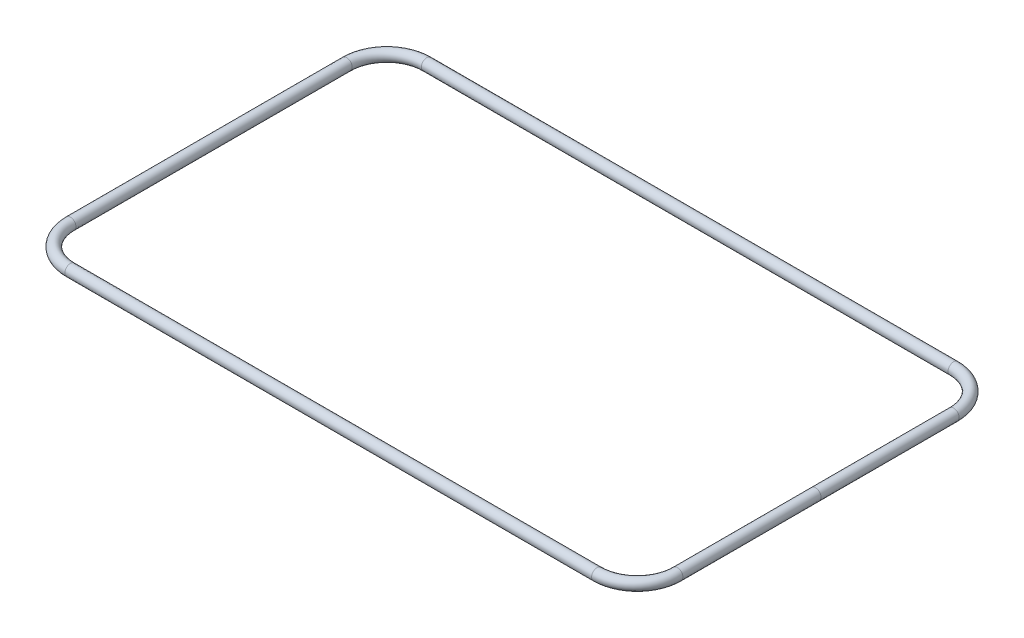
ISO-10303-21;
HEADER;
FILE_DESCRIPTION(('STEP AP214'),'2;1');
FILE_NAME('part.step','',(''),(''),'','','');
FILE_SCHEMA(('AUTOMOTIVE_DESIGN { 1 0 10303 214 1 1 1 1 }'));
ENDSEC;
DATA;
#1=APPLICATION_CONTEXT('core data for automotive mechanical design processes');
#2=APPLICATION_PROTOCOL_DEFINITION('international standard','automotive_design',2000,#1);
#3=PRODUCT_CONTEXT('',#1,'mechanical');
#4=PRODUCT('Part','Part','',(#3));
#5=PRODUCT_RELATED_PRODUCT_CATEGORY('part','',(#4));
#6=PRODUCT_DEFINITION_FORMATION('','',#4);
#7=PRODUCT_DEFINITION_CONTEXT('part definition',#1,'design');
#8=PRODUCT_DEFINITION('design','',#6,#7);
#9=PRODUCT_DEFINITION_SHAPE('','',#8);
#10=(LENGTH_UNIT() NAMED_UNIT(*) SI_UNIT(.MILLI.,.METRE.));
#11=(NAMED_UNIT(*) PLANE_ANGLE_UNIT() SI_UNIT($,.RADIAN.));
#12=(NAMED_UNIT(*) SI_UNIT($,.STERADIAN.) SOLID_ANGLE_UNIT());
#13=UNCERTAINTY_MEASURE_WITH_UNIT(LENGTH_MEASURE(1.E-05),#10,'distance_accuracy_value','');
#14=(GEOMETRIC_REPRESENTATION_CONTEXT(3) GLOBAL_UNCERTAINTY_ASSIGNED_CONTEXT((#13)) GLOBAL_UNIT_ASSIGNED_CONTEXT((#10,
#11,#12)) REPRESENTATION_CONTEXT('',''));
#15=CARTESIAN_POINT('',(0.,0.,0.));
#16=DIRECTION('',(0.,0.,1.));
#17=DIRECTION('',(1.,0.,0.));
#18=AXIS2_PLACEMENT_3D('',#15,#16,#17);
#19=CARTESIAN_POINT('',(96.0967751442048,0.,-43.7388));
#20=DIRECTION('',(0.,0.,1.));
#21=DIRECTION('',(1.,0.,0.));
#22=AXIS2_PLACEMENT_3D('',#19,#20,#21);
#23=CYLINDRICAL_SURFACE('',#22,1.76529999999999);
#24=CARTESIAN_POINT('',(96.0967751442048,0.,0.));
#25=DIRECTION('',(0.,0.,1.));
#26=DIRECTION('',(1.,0.,0.));
#27=AXIS2_PLACEMENT_3D('',#24,#25,#26);
#28=CIRCLE('',#27,1.76529999999999);
#29=CARTESIAN_POINT('',(97.8620751442048,0.,0.));
#30=VERTEX_POINT('',#29);
#31=EDGE_CURVE('E63',#30,#30,#28,.T.);
#32=ORIENTED_EDGE('',*,*,#31,.F.);
#33=EDGE_LOOP('',(#32));
#34=FACE_BOUND('',#33,.T.);
#35=CARTESIAN_POINT('',(96.0967751442048,0.,-43.7388));
#36=DIRECTION('',(0.,0.,1.));
#37=DIRECTION('',(1.,0.,0.));
#38=AXIS2_PLACEMENT_3D('',#35,#36,#37);
#39=CIRCLE('',#38,1.76529999999999);
#40=CARTESIAN_POINT('',(97.8620751442048,0.,-43.7388));
#41=VERTEX_POINT('',#40);
#42=EDGE_CURVE('E10',#41,#41,#39,.T.);
#43=ORIENTED_EDGE('',*,*,#42,.T.);
#44=EDGE_LOOP('',(#43));
#45=FACE_BOUND('',#44,.T.);
#46=ADVANCED_FACE('F32',(#34,#45),#23,.T.);
#47=CARTESIAN_POINT('',(83.3967751442048,0.,-43.7388));
#48=DIRECTION('',(0.,-1.,0.));
#49=DIRECTION('',(0.,0.,-1.));
#50=AXIS2_PLACEMENT_3D('',#47,#48,#49);
#51=TOROIDAL_SURFACE('',#50,12.7,1.76529999999999);
#52=CARTESIAN_POINT('',(83.3967751442048,0.,-56.4388));
#53=DIRECTION('',(1.,0.,0.));
#54=DIRECTION('',(0.,0.,-1.));
#55=AXIS2_PLACEMENT_3D('',#52,#53,#54);
#56=CIRCLE('',#55,1.76529999999999);
#57=CARTESIAN_POINT('',(83.3967751442048,0.,-58.2041));
#58=VERTEX_POINT('',#57);
#59=EDGE_CURVE('E38',#58,#58,#56,.T.);
#60=CARTESIAN_POINT('',(83.3967751442048,0.,-43.7388));
#61=DIRECTION('',(0.,-1.,0.));
#62=DIRECTION('',(0.,0.,-1.));
#63=AXIS2_PLACEMENT_3D('',#60,#61,#62);
#64=CIRCLE('',#63,14.4653);
#65=EDGE_CURVE('',#58,#41,#64,.T.);
#66=ORIENTED_EDGE('',*,*,#59,.T.);
#67=ORIENTED_EDGE('',*,*,#42,.F.);
#68=ORIENTED_EDGE('',*,*,#65,.T.);
#69=ORIENTED_EDGE('',*,*,#65,.F.);
#70=EDGE_LOOP('',(#66,#68,#67,#69));
#71=FACE_BOUND('',#70,.T.);
#72=ADVANCED_FACE('F70',(#71),#51,.T.);
#73=CARTESIAN_POINT('',(-83.3967751442048,0.,-56.4388));
#74=DIRECTION('',(1.,0.,0.));
#75=DIRECTION('',(0.,0.,-1.));
#76=AXIS2_PLACEMENT_3D('',#73,#74,#75);
#77=CYLINDRICAL_SURFACE('',#76,1.76529999999999);
#78=ORIENTED_EDGE('',*,*,#59,.F.);
#79=EDGE_LOOP('',(#78));
#80=FACE_BOUND('',#79,.T.);
#81=CARTESIAN_POINT('',(-83.3967751442048,0.,-56.4388));
#82=DIRECTION('',(1.,0.,0.));
#83=DIRECTION('',(0.,0.,-1.));
#84=AXIS2_PLACEMENT_3D('',#81,#82,#83);
#85=CIRCLE('',#84,1.76529999999999);
#86=CARTESIAN_POINT('',(-83.3967751442048,0.,-58.2041));
#87=VERTEX_POINT('',#86);
#88=EDGE_CURVE('E42',#87,#87,#85,.T.);
#89=ORIENTED_EDGE('',*,*,#88,.T.);
#90=EDGE_LOOP('',(#89));
#91=FACE_BOUND('',#90,.T.);
#92=ADVANCED_FACE('F74',(#80,#91),#77,.T.);
#93=CARTESIAN_POINT('',(-83.3967751442048,0.,-43.7388));
#94=DIRECTION('',(0.,-1.,0.));
#95=DIRECTION('',(0.,0.,-1.));
#96=AXIS2_PLACEMENT_3D('',#93,#94,#95);
#97=TOROIDAL_SURFACE('',#96,12.7,1.76529999999999);
#98=CARTESIAN_POINT('',(-96.0967751442048,0.,-43.7388));
#99=DIRECTION('',(0.,0.,-1.));
#100=DIRECTION('',(-1.,0.,0.));
#101=AXIS2_PLACEMENT_3D('',#98,#99,#100);
#102=CIRCLE('',#101,1.76529999999999);
#103=CARTESIAN_POINT('',(-97.8620751442048,0.,-43.7388));
#104=VERTEX_POINT('',#103);
#105=EDGE_CURVE('E46',#104,#104,#102,.T.);
#106=CARTESIAN_POINT('',(-83.3967751442048,0.,-43.7388));
#107=DIRECTION('',(0.,-1.,0.));
#108=DIRECTION('',(0.,0.,-1.));
#109=AXIS2_PLACEMENT_3D('',#106,#107,#108);
#110=CIRCLE('',#109,14.4653);
#111=EDGE_CURVE('',#104,#87,#110,.T.);
#112=ORIENTED_EDGE('',*,*,#105,.T.);
#113=ORIENTED_EDGE('',*,*,#88,.F.);
#114=ORIENTED_EDGE('',*,*,#111,.T.);
#115=ORIENTED_EDGE('',*,*,#111,.F.);
#116=EDGE_LOOP('',(#112,#114,#113,#115));
#117=FACE_BOUND('',#116,.T.);
#118=ADVANCED_FACE('F79',(#117),#97,.T.);
#119=CARTESIAN_POINT('',(-96.0967751442048,0.,43.7388));
#120=DIRECTION('',(0.,0.,-1.));
#121=DIRECTION('',(-1.,0.,0.));
#122=AXIS2_PLACEMENT_3D('',#119,#120,#121);
#123=CYLINDRICAL_SURFACE('',#122,1.76529999999999);
#124=ORIENTED_EDGE('',*,*,#105,.F.);
#125=EDGE_LOOP('',(#124));
#126=FACE_BOUND('',#125,.T.);
#127=CARTESIAN_POINT('',(-96.0967751442048,0.,43.7388));
#128=DIRECTION('',(0.,0.,-1.));
#129=DIRECTION('',(-1.,0.,0.));
#130=AXIS2_PLACEMENT_3D('',#127,#128,#129);
#131=CIRCLE('',#130,1.76529999999999);
#132=CARTESIAN_POINT('',(-97.8620751442048,0.,43.7388));
#133=VERTEX_POINT('',#132);
#134=EDGE_CURVE('E51',#133,#133,#131,.T.);
#135=ORIENTED_EDGE('',*,*,#134,.T.);
#136=EDGE_LOOP('',(#135));
#137=FACE_BOUND('',#136,.T.);
#138=ADVANCED_FACE('F85',(#126,#137),#123,.T.);
#139=CARTESIAN_POINT('',(-83.3967751442048,0.,43.7388));
#140=DIRECTION('',(0.,-1.,0.));
#141=DIRECTION('',(0.,0.,-1.));
#142=AXIS2_PLACEMENT_3D('',#139,#140,#141);
#143=TOROIDAL_SURFACE('',#142,12.7,1.76529999999999);
#144=CARTESIAN_POINT('',(-83.3967751442048,0.,56.4388));
#145=DIRECTION('',(-1.,0.,0.));
#146=DIRECTION('',(0.,0.,1.));
#147=AXIS2_PLACEMENT_3D('',#144,#145,#146);
#148=CIRCLE('',#147,1.76529999999999);
#149=CARTESIAN_POINT('',(-83.3967751442048,0.,58.2041));
#150=VERTEX_POINT('',#149);
#151=EDGE_CURVE('E54',#150,#150,#148,.T.);
#152=CARTESIAN_POINT('',(-83.3967751442048,0.,43.7388));
#153=DIRECTION('',(0.,-1.,0.));
#154=DIRECTION('',(0.,0.,-1.));
#155=AXIS2_PLACEMENT_3D('',#152,#153,#154);
#156=CIRCLE('',#155,14.4653);
#157=EDGE_CURVE('',#150,#133,#156,.T.);
#158=ORIENTED_EDGE('',*,*,#151,.T.);
#159=ORIENTED_EDGE('',*,*,#134,.F.);
#160=ORIENTED_EDGE('',*,*,#157,.T.);
#161=ORIENTED_EDGE('',*,*,#157,.F.);
#162=EDGE_LOOP('',(#158,#160,#159,#161));
#163=FACE_BOUND('',#162,.T.);
#164=ADVANCED_FACE('F89',(#163),#143,.T.);
#165=CARTESIAN_POINT('',(83.3967751442048,0.,56.4388));
#166=DIRECTION('',(-1.,0.,0.));
#167=DIRECTION('',(0.,0.,1.));
#168=AXIS2_PLACEMENT_3D('',#165,#166,#167);
#169=CYLINDRICAL_SURFACE('',#168,1.76529999999999);
#170=ORIENTED_EDGE('',*,*,#151,.F.);
#171=EDGE_LOOP('',(#170));
#172=FACE_BOUND('',#171,.T.);
#173=CARTESIAN_POINT('',(83.3967751442048,0.,56.4388));
#174=DIRECTION('',(-1.,0.,0.));
#175=DIRECTION('',(0.,0.,1.));
#176=AXIS2_PLACEMENT_3D('',#173,#174,#175);
#177=CIRCLE('',#176,1.76529999999999);
#178=CARTESIAN_POINT('',(83.3967751442048,0.,58.2041));
#179=VERTEX_POINT('',#178);
#180=EDGE_CURVE('E57',#179,#179,#177,.T.);
#181=ORIENTED_EDGE('',*,*,#180,.T.);
#182=EDGE_LOOP('',(#181));
#183=FACE_BOUND('',#182,.T.);
#184=ADVANCED_FACE('F93',(#172,#183),#169,.T.);
#185=CARTESIAN_POINT('',(83.3967751442048,0.,43.7388));
#186=DIRECTION('',(0.,-1.,0.));
#187=DIRECTION('',(0.,0.,-1.));
#188=AXIS2_PLACEMENT_3D('',#185,#186,#187);
#189=TOROIDAL_SURFACE('',#188,12.7,1.76529999999999);
#190=CARTESIAN_POINT('',(96.0967751442048,0.,43.7388));
#191=DIRECTION('',(0.,0.,1.));
#192=DIRECTION('',(1.,0.,0.));
#193=AXIS2_PLACEMENT_3D('',#190,#191,#192);
#194=CIRCLE('',#193,1.76529999999999);
#195=CARTESIAN_POINT('',(97.8620751442048,0.,43.7388));
#196=VERTEX_POINT('',#195);
#197=EDGE_CURVE('E60',#196,#196,#194,.T.);
#198=CARTESIAN_POINT('',(83.3967751442048,0.,43.7388));
#199=DIRECTION('',(0.,-1.,0.));
#200=DIRECTION('',(0.,0.,-1.));
#201=AXIS2_PLACEMENT_3D('',#198,#199,#200);
#202=CIRCLE('',#201,14.4653);
#203=EDGE_CURVE('',#196,#179,#202,.T.);
#204=ORIENTED_EDGE('',*,*,#197,.T.);
#205=ORIENTED_EDGE('',*,*,#180,.F.);
#206=ORIENTED_EDGE('',*,*,#203,.T.);
#207=ORIENTED_EDGE('',*,*,#203,.F.);
#208=EDGE_LOOP('',(#204,#206,#205,#207));
#209=FACE_BOUND('',#208,.T.);
#210=ADVANCED_FACE('F97',(#209),#189,.T.);
#211=CARTESIAN_POINT('',(96.0967751442048,0.,0.));
#212=DIRECTION('',(0.,0.,1.));
#213=DIRECTION('',(1.,0.,0.));
#214=AXIS2_PLACEMENT_3D('',#211,#212,#213);
#215=CYLINDRICAL_SURFACE('',#214,1.76529999999999);
#216=ORIENTED_EDGE('',*,*,#197,.F.);
#217=EDGE_LOOP('',(#216));
#218=FACE_BOUND('',#217,.T.);
#219=ORIENTED_EDGE('',*,*,#31,.T.);
#220=EDGE_LOOP('',(#219));
#221=FACE_BOUND('',#220,.T.);
#222=ADVANCED_FACE('F67',(#218,#221),#215,.T.);
#223=CLOSED_SHELL('',(#46,#72,#92,#118,#138,#164,#184,#210,#222));
#224=MANIFOLD_SOLID_BREP('B2',#223);
#225=ADVANCED_BREP_SHAPE_REPRESENTATION('',(#18,#224),#14);
#226=SHAPE_DEFINITION_REPRESENTATION(#9,#225);
ENDSEC;
END-ISO-10303-21;
